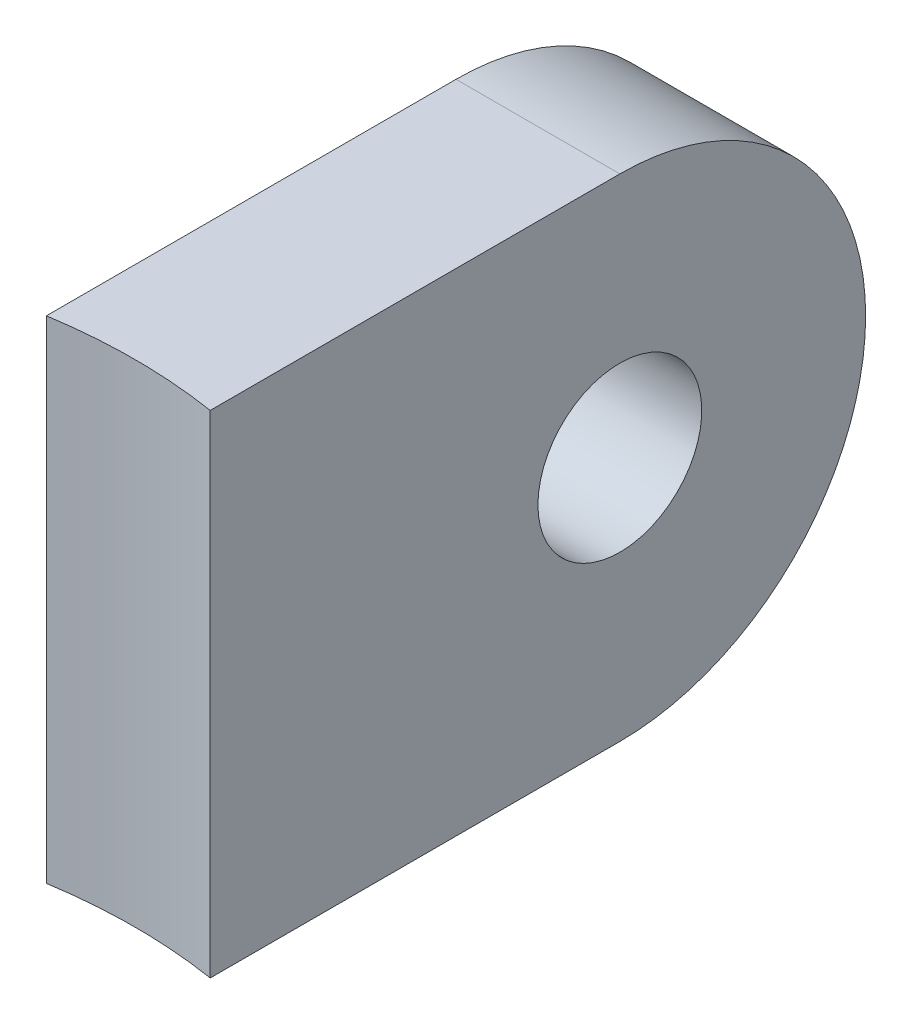
ISO-10303-21;
HEADER;
FILE_DESCRIPTION(('STEP AP214'),'2;1');
FILE_NAME('part.step','',(''),(''),'','','');
FILE_SCHEMA(('AUTOMOTIVE_DESIGN { 1 0 10303 214 1 1 1 1 }'));
ENDSEC;
DATA;
#1=APPLICATION_CONTEXT('core data for automotive mechanical design processes');
#2=APPLICATION_PROTOCOL_DEFINITION('international standard','automotive_design',2000,#1);
#3=PRODUCT_CONTEXT('',#1,'mechanical');
#4=PRODUCT('Part','Part','',(#3));
#5=PRODUCT_RELATED_PRODUCT_CATEGORY('part','',(#4));
#6=PRODUCT_DEFINITION_FORMATION('','',#4);
#7=PRODUCT_DEFINITION_CONTEXT('part definition',#1,'design');
#8=PRODUCT_DEFINITION('design','',#6,#7);
#9=PRODUCT_DEFINITION_SHAPE('','',#8);
#10=(LENGTH_UNIT() NAMED_UNIT(*) SI_UNIT(.MILLI.,.METRE.));
#11=(NAMED_UNIT(*) PLANE_ANGLE_UNIT() SI_UNIT($,.RADIAN.));
#12=(NAMED_UNIT(*) SI_UNIT($,.STERADIAN.) SOLID_ANGLE_UNIT());
#13=UNCERTAINTY_MEASURE_WITH_UNIT(LENGTH_MEASURE(1.E-05),#10,'distance_accuracy_value','');
#14=(GEOMETRIC_REPRESENTATION_CONTEXT(3) GLOBAL_UNCERTAINTY_ASSIGNED_CONTEXT((#13)) GLOBAL_UNIT_ASSIGNED_CONTEXT((#10,
#11,#12)) REPRESENTATION_CONTEXT('',''));
#15=CARTESIAN_POINT('',(0.,0.,0.));
#16=DIRECTION('',(0.,0.,1.));
#17=DIRECTION('',(1.,0.,0.));
#18=AXIS2_PLACEMENT_3D('',#15,#16,#17);
#19=CARTESIAN_POINT('',(0.,15.,0.));
#20=DIRECTION('',(0.,-1.,0.));
#21=DIRECTION('',(0.,0.,-1.));
#22=AXIS2_PLACEMENT_3D('',#19,#20,#21);
#23=CYLINDRICAL_SURFACE('',#22,15.875);
#24=CARTESIAN_POINT('',(0.,0.,0.));
#25=DIRECTION('',(0.,-1.,0.));
#26=DIRECTION('',(0.,0.,1.));
#27=AXIS2_PLACEMENT_3D('',#24,#25,#26);
#28=CIRCLE('',#27,15.875);
#29=CARTESIAN_POINT('',(-2.5,0.,-15.6769137587728));
#30=VERTEX_POINT('',#29);
#31=CARTESIAN_POINT('',(2.5,0.,-15.6769137587728));
#32=VERTEX_POINT('',#31);
#33=EDGE_CURVE('E100',#30,#32,#28,.T.);
#34=ORIENTED_EDGE('',*,*,#33,.T.);
#35=DIRECTION('',(0.,-1.,0.));
#36=VECTOR('',#35,1.);
#37=CARTESIAN_POINT('',(2.5,15.,-15.6769137587728));
#38=LINE('',#37,#36);
#39=CARTESIAN_POINT('',(2.5,15.,-15.6769137587728));
#40=VERTEX_POINT('',#39);
#41=EDGE_CURVE('E84',#40,#32,#38,.T.);
#42=ORIENTED_EDGE('',*,*,#41,.F.);
#43=CARTESIAN_POINT('',(0.,15.,0.));
#44=DIRECTION('',(0.,-1.,0.));
#45=DIRECTION('',(0.,0.,1.));
#46=AXIS2_PLACEMENT_3D('',#43,#44,#45);
#47=CIRCLE('',#46,15.875);
#48=CARTESIAN_POINT('',(-2.5,15.,-15.6769137587728));
#49=VERTEX_POINT('',#48);
#50=EDGE_CURVE('E89',#49,#40,#47,.T.);
#51=ORIENTED_EDGE('',*,*,#50,.F.);
#52=DIRECTION('',(0.,-1.,0.));
#53=VECTOR('',#52,1.);
#54=CARTESIAN_POINT('',(-2.5,15.,-15.6769137587728));
#55=LINE('',#54,#53);
#56=EDGE_CURVE('E102',#49,#30,#55,.T.);
#57=ORIENTED_EDGE('',*,*,#56,.T.);
#58=EDGE_LOOP('',(#34,#42,#51,#57));
#59=FACE_BOUND('',#58,.T.);
#60=ADVANCED_FACE('F38',(#59),#23,.F.);
#61=CARTESIAN_POINT('',(2.5,15.,-35.6769137587728));
#62=DIRECTION('',(-1.,0.,0.));
#63=DIRECTION('',(0.,0.,1.));
#64=AXIS2_PLACEMENT_3D('',#61,#62,#63);
#65=PLANE('',#64);
#66=CARTESIAN_POINT('',(2.5,7.5,-28.1769137587728));
#67=DIRECTION('',(-1.,0.,0.));
#68=DIRECTION('',(0.,0.,1.));
#69=AXIS2_PLACEMENT_3D('',#66,#67,#68);
#70=CIRCLE('',#69,2.5);
#71=CARTESIAN_POINT('',(2.5,7.5,-25.6769137587728));
#72=VERTEX_POINT('',#71);
#73=EDGE_CURVE('E128',#72,#72,#70,.T.);
#74=ORIENTED_EDGE('',*,*,#73,.T.);
#75=EDGE_LOOP('',(#74));
#76=FACE_BOUND('',#75,.T.);
#77=DIRECTION('',(0.,0.,-1.));
#78=VECTOR('',#77,1.);
#79=CARTESIAN_POINT('',(2.5,0.,-35.6769137587728));
#80=LINE('',#79,#78);
#81=CARTESIAN_POINT('',(2.5,0.,-28.1769137587728));
#82=VERTEX_POINT('',#81);
#83=EDGE_CURVE('E118',#32,#82,#80,.T.);
#84=ORIENTED_EDGE('',*,*,#83,.T.);
#85=CARTESIAN_POINT('',(2.5,7.5,-28.1769137587728));
#86=DIRECTION('',(-1.,0.,0.));
#87=DIRECTION('',(0.,0.,1.));
#88=AXIS2_PLACEMENT_3D('',#85,#86,#87);
#89=CIRCLE('',#88,7.5);
#90=CARTESIAN_POINT('',(2.5,7.5,-35.6769137587728));
#91=VERTEX_POINT('',#90);
#92=EDGE_CURVE('E47',#82,#91,#89,.F.);
#93=ORIENTED_EDGE('',*,*,#92,.T.);
#94=CARTESIAN_POINT('',(2.5,7.5,-28.1769137587728));
#95=DIRECTION('',(-1.,0.,0.));
#96=DIRECTION('',(0.,0.,1.));
#97=AXIS2_PLACEMENT_3D('',#94,#95,#96);
#98=CIRCLE('',#97,7.5);
#99=CARTESIAN_POINT('',(2.5,15.,-28.1769137587728));
#100=VERTEX_POINT('',#99);
#101=EDGE_CURVE('E54',#91,#100,#98,.F.);
#102=ORIENTED_EDGE('',*,*,#101,.T.);
#103=DIRECTION('',(0.,0.,-1.));
#104=VECTOR('',#103,1.);
#105=CARTESIAN_POINT('',(2.5,15.,-35.6769137587728));
#106=LINE('',#105,#104);
#107=EDGE_CURVE('E80',#40,#100,#106,.T.);
#108=ORIENTED_EDGE('',*,*,#107,.F.);
#109=ORIENTED_EDGE('',*,*,#41,.T.);
#110=EDGE_LOOP('',(#84,#93,#102,#108,#109));
#111=FACE_BOUND('',#110,.T.);
#112=ADVANCED_FACE('F82',(#76,#111),#65,.F.);
#113=CARTESIAN_POINT('',(-2.5,15.,-15.6769137587728));
#114=DIRECTION('',(1.,0.,0.));
#115=DIRECTION('',(0.,0.,-1.));
#116=AXIS2_PLACEMENT_3D('',#113,#114,#115);
#117=PLANE('',#116);
#118=CARTESIAN_POINT('',(-2.5,7.5,-28.1769137587728));
#119=DIRECTION('',(-1.,0.,0.));
#120=DIRECTION('',(0.,0.,1.));
#121=AXIS2_PLACEMENT_3D('',#118,#119,#120);
#122=CIRCLE('',#121,2.5);
#123=CARTESIAN_POINT('',(-2.5,7.5,-25.6769137587728));
#124=VERTEX_POINT('',#123);
#125=EDGE_CURVE('E125',#124,#124,#122,.T.);
#126=ORIENTED_EDGE('',*,*,#125,.F.);
#127=EDGE_LOOP('',(#126));
#128=FACE_BOUND('',#127,.T.);
#129=CARTESIAN_POINT('',(-2.5,7.5,-28.1769137587728));
#130=DIRECTION('',(1.,0.,0.));
#131=DIRECTION('',(0.,0.,-1.));
#132=AXIS2_PLACEMENT_3D('',#129,#130,#131);
#133=CIRCLE('',#132,7.5);
#134=CARTESIAN_POINT('',(-2.5,15.,-28.1769137587728));
#135=VERTEX_POINT('',#134);
#136=CARTESIAN_POINT('',(-2.5,7.5,-35.6769137587728));
#137=VERTEX_POINT('',#136);
#138=EDGE_CURVE('E101',#135,#137,#133,.F.);
#139=ORIENTED_EDGE('',*,*,#138,.T.);
#140=CARTESIAN_POINT('',(-2.5,7.5,-28.1769137587728));
#141=DIRECTION('',(1.,0.,0.));
#142=DIRECTION('',(0.,0.,-1.));
#143=AXIS2_PLACEMENT_3D('',#140,#141,#142);
#144=CIRCLE('',#143,7.5);
#145=CARTESIAN_POINT('',(-2.5,0.,-28.1769137587728));
#146=VERTEX_POINT('',#145);
#147=EDGE_CURVE('E104',#137,#146,#144,.F.);
#148=ORIENTED_EDGE('',*,*,#147,.T.);
#149=DIRECTION('',(0.,0.,1.));
#150=VECTOR('',#149,1.);
#151=CARTESIAN_POINT('',(-2.5,0.,-15.6769137587728));
#152=LINE('',#151,#150);
#153=EDGE_CURVE('E97',#146,#30,#152,.T.);
#154=ORIENTED_EDGE('',*,*,#153,.T.);
#155=ORIENTED_EDGE('',*,*,#56,.F.);
#156=DIRECTION('',(0.,0.,1.));
#157=VECTOR('',#156,1.);
#158=CARTESIAN_POINT('',(-2.5,15.,-15.6769137587728));
#159=LINE('',#158,#157);
#160=EDGE_CURVE('E88',#135,#49,#159,.T.);
#161=ORIENTED_EDGE('',*,*,#160,.F.);
#162=EDGE_LOOP('',(#139,#148,#154,#155,#161));
#163=FACE_BOUND('',#162,.T.);
#164=ADVANCED_FACE('F138',(#128,#163),#117,.F.);
#165=CARTESIAN_POINT('',(0.,15.,0.));
#166=DIRECTION('',(0.,1.,0.));
#167=DIRECTION('',(0.,0.,1.));
#168=AXIS2_PLACEMENT_3D('',#165,#166,#167);
#169=PLANE('',#168);
#170=ORIENTED_EDGE('',*,*,#107,.T.);
#171=DIRECTION('',(-1.,0.,0.));
#172=VECTOR('',#171,1.);
#173=CARTESIAN_POINT('',(-2.5,15.,-28.1769137587728));
#174=LINE('',#173,#172);
#175=EDGE_CURVE('E11',#100,#135,#174,.T.);
#176=ORIENTED_EDGE('',*,*,#175,.T.);
#177=ORIENTED_EDGE('',*,*,#160,.T.);
#178=ORIENTED_EDGE('',*,*,#50,.T.);
#179=EDGE_LOOP('',(#170,#176,#177,#178));
#180=FACE_BOUND('',#179,.T.);
#181=ADVANCED_FACE('F92',(#180),#169,.T.);
#182=CARTESIAN_POINT('',(0.,0.,0.));
#183=DIRECTION('',(0.,1.,0.));
#184=DIRECTION('',(0.,0.,1.));
#185=AXIS2_PLACEMENT_3D('',#182,#183,#184);
#186=PLANE('',#185);
#187=ORIENTED_EDGE('',*,*,#153,.F.);
#188=DIRECTION('',(-1.,0.,0.));
#189=VECTOR('',#188,1.);
#190=CARTESIAN_POINT('',(0.,0.,-28.1769137587728));
#191=LINE('',#190,#189);
#192=EDGE_CURVE('E110',#146,#82,#191,.F.);
#193=ORIENTED_EDGE('',*,*,#192,.T.);
#194=ORIENTED_EDGE('',*,*,#83,.F.);
#195=ORIENTED_EDGE('',*,*,#33,.F.);
#196=EDGE_LOOP('',(#187,#193,#194,#195));
#197=FACE_BOUND('',#196,.T.);
#198=ADVANCED_FACE('F117',(#197),#186,.F.);
#199=CARTESIAN_POINT('',(0.,7.5,-28.1769137587728));
#200=DIRECTION('',(1.,0.,0.));
#201=DIRECTION('',(0.,0.,-1.));
#202=AXIS2_PLACEMENT_3D('',#199,#200,#201);
#203=CYLINDRICAL_SURFACE('',#202,7.5);
#204=ORIENTED_EDGE('',*,*,#175,.F.);
#205=ORIENTED_EDGE('',*,*,#101,.F.);
#206=DIRECTION('',(-1.,0.,0.));
#207=VECTOR('',#206,1.);
#208=CARTESIAN_POINT('',(2.5,7.5,-35.6769137587728));
#209=LINE('',#208,#207);
#210=EDGE_CURVE('E42',#137,#91,#209,.F.);
#211=ORIENTED_EDGE('',*,*,#210,.F.);
#212=ORIENTED_EDGE('',*,*,#138,.F.);
#213=EDGE_LOOP('',(#204,#205,#211,#212));
#214=FACE_BOUND('',#213,.T.);
#215=ADVANCED_FACE('F40',(#214),#203,.T.);
#216=CARTESIAN_POINT('',(-2.5,7.5,-28.1769137587728));
#217=DIRECTION('',(-1.,0.,0.));
#218=DIRECTION('',(0.,0.,1.));
#219=AXIS2_PLACEMENT_3D('',#216,#217,#218);
#220=CYLINDRICAL_SURFACE('',#219,7.5);
#221=ORIENTED_EDGE('',*,*,#92,.F.);
#222=ORIENTED_EDGE('',*,*,#192,.F.);
#223=ORIENTED_EDGE('',*,*,#147,.F.);
#224=ORIENTED_EDGE('',*,*,#210,.T.);
#225=EDGE_LOOP('',(#221,#222,#223,#224));
#226=FACE_BOUND('',#225,.T.);
#227=ADVANCED_FACE('F134',(#226),#220,.T.);
#228=CARTESIAN_POINT('',(2.5,7.5,-28.1769137587728));
#229=DIRECTION('',(-1.,0.,0.));
#230=DIRECTION('',(0.,0.,1.));
#231=AXIS2_PLACEMENT_3D('',#228,#229,#230);
#232=CYLINDRICAL_SURFACE('',#231,2.5);
#233=ORIENTED_EDGE('',*,*,#73,.F.);
#234=EDGE_LOOP('',(#233));
#235=FACE_BOUND('',#234,.T.);
#236=ORIENTED_EDGE('',*,*,#125,.T.);
#237=EDGE_LOOP('',(#236));
#238=FACE_BOUND('',#237,.T.);
#239=ADVANCED_FACE('F155',(#235,#238),#232,.F.);
#240=CLOSED_SHELL('',(#60,#112,#164,#181,#198,#215,#227,#239));
#241=MANIFOLD_SOLID_BREP('B2',#240);
#242=ADVANCED_BREP_SHAPE_REPRESENTATION('',(#18,#241),#14);
#243=SHAPE_DEFINITION_REPRESENTATION(#9,#242);
ENDSEC;
END-ISO-10303-21;
